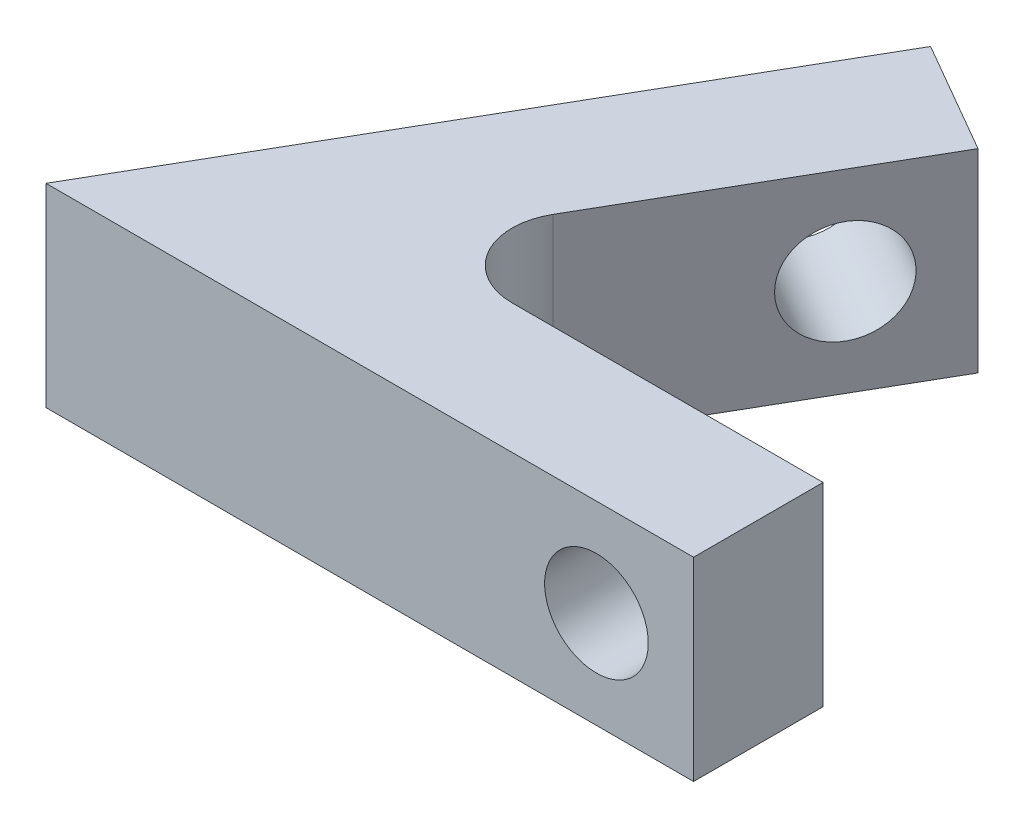
ISO-10303-21;
HEADER;
FILE_DESCRIPTION(('STEP AP214'),'2;1');
FILE_NAME('part.step','',(''),(''),'','','');
FILE_SCHEMA(('AUTOMOTIVE_DESIGN { 1 0 10303 214 1 1 1 1 }'));
ENDSEC;
DATA;
#1=APPLICATION_CONTEXT('core data for automotive mechanical design processes');
#2=APPLICATION_PROTOCOL_DEFINITION('international standard','automotive_design',2000,#1);
#3=PRODUCT_CONTEXT('',#1,'mechanical');
#4=PRODUCT('Part','Part','',(#3));
#5=PRODUCT_RELATED_PRODUCT_CATEGORY('part','',(#4));
#6=PRODUCT_DEFINITION_FORMATION('','',#4);
#7=PRODUCT_DEFINITION_CONTEXT('part definition',#1,'design');
#8=PRODUCT_DEFINITION('design','',#6,#7);
#9=PRODUCT_DEFINITION_SHAPE('','',#8);
#10=(LENGTH_UNIT() NAMED_UNIT(*) SI_UNIT(.MILLI.,.METRE.));
#11=(NAMED_UNIT(*) PLANE_ANGLE_UNIT() SI_UNIT($,.RADIAN.));
#12=(NAMED_UNIT(*) SI_UNIT($,.STERADIAN.) SOLID_ANGLE_UNIT());
#13=UNCERTAINTY_MEASURE_WITH_UNIT(LENGTH_MEASURE(1.E-05),#10,'distance_accuracy_value','');
#14=(GEOMETRIC_REPRESENTATION_CONTEXT(3) GLOBAL_UNCERTAINTY_ASSIGNED_CONTEXT((#13)) GLOBAL_UNIT_ASSIGNED_CONTEXT((#10,
#11,#12)) REPRESENTATION_CONTEXT('',''));
#15=CARTESIAN_POINT('',(0.,0.,0.));
#16=DIRECTION('',(0.,0.,1.));
#17=DIRECTION('',(1.,0.,0.));
#18=AXIS2_PLACEMENT_3D('',#15,#16,#17);
#19=CARTESIAN_POINT('',(6.53589838486228,6.,-11.3205080756887));
#20=DIRECTION('',(-0.866025403784436,0.,-0.500000000000004));
#21=DIRECTION('',(-0.500000000000004,0.,0.866025403784436));
#22=AXIS2_PLACEMENT_3D('',#19,#20,#21);
#23=PLANE('',#22);
#24=CARTESIAN_POINT('',(5.03589838486226,3.,-8.72243186433539));
#25=DIRECTION('',(-0.866025403784436,0.,-0.500000000000004));
#26=DIRECTION('',(-0.500000000000004,0.,0.866025403784436));
#27=AXIS2_PLACEMENT_3D('',#24,#25,#26);
#28=CIRCLE('',#27,1.6);
#29=CARTESIAN_POINT('',(4.23589838486226,3.,-7.33679121828029));
#30=VERTEX_POINT('',#29);
#31=EDGE_CURVE('E154',#30,#30,#28,.T.);
#32=ORIENTED_EDGE('',*,*,#31,.T.);
#33=EDGE_LOOP('',(#32));
#34=FACE_BOUND('',#33,.T.);
#35=DIRECTION('',(0.500000000000004,0.,-0.866025403784436));
#36=VECTOR('',#35,1.);
#37=CARTESIAN_POINT('',(6.53589838486228,6.,-11.3205080756887));
#38=LINE('',#37,#36);
#39=CARTESIAN_POINT('',(1.7320508075689,6.,-3.00000000000001));
#40=VERTEX_POINT('',#39);
#41=CARTESIAN_POINT('',(6.53589838486228,6.,-11.3205080756887));
#42=VERTEX_POINT('',#41);
#43=EDGE_CURVE('E92',#40,#42,#38,.T.);
#44=ORIENTED_EDGE('',*,*,#43,.F.);
#45=DIRECTION('',(0.,-1.,0.));
#46=VECTOR('',#45,1.);
#47=CARTESIAN_POINT('',(1.7320508075689,0.,-3.00000000000001));
#48=LINE('',#47,#46);
#49=CARTESIAN_POINT('',(1.7320508075689,0.,-3.00000000000001));
#50=VERTEX_POINT('',#49);
#51=EDGE_CURVE('E115',#40,#50,#48,.T.);
#52=ORIENTED_EDGE('',*,*,#51,.T.);
#53=DIRECTION('',(0.500000000000004,0.,-0.866025403784436));
#54=VECTOR('',#53,1.);
#55=CARTESIAN_POINT('',(6.53589838486228,0.,-11.3205080756887));
#56=LINE('',#55,#54);
#57=CARTESIAN_POINT('',(6.53589838486228,0.,-11.3205080756887));
#58=VERTEX_POINT('',#57);
#59=EDGE_CURVE('E113',#50,#58,#56,.T.);
#60=ORIENTED_EDGE('',*,*,#59,.T.);
#61=DIRECTION('',(0.,-1.,0.));
#62=VECTOR('',#61,1.);
#63=CARTESIAN_POINT('',(6.53589838486228,6.,-11.3205080756887));
#64=LINE('',#63,#62);
#65=EDGE_CURVE('E107',#42,#58,#64,.T.);
#66=ORIENTED_EDGE('',*,*,#65,.F.);
#67=EDGE_LOOP('',(#44,#52,#60,#66));
#68=FACE_BOUND('',#67,.T.);
#69=ADVANCED_FACE('F34',(#34,#68),#23,.F.);
#70=CARTESIAN_POINT('',(3.07179676972453,6.,-13.3205080756887));
#71=DIRECTION('',(-0.500000000000004,0.,0.866025403784436));
#72=DIRECTION('',(0.866025403784436,0.,0.500000000000004));
#73=AXIS2_PLACEMENT_3D('',#70,#71,#72);
#74=PLANE('',#73);
#75=DIRECTION('',(-0.866025403784436,0.,-0.500000000000004));
#76=VECTOR('',#75,1.);
#77=CARTESIAN_POINT('',(3.07179676972453,0.,-13.3205080756887));
#78=LINE('',#77,#76);
#79=CARTESIAN_POINT('',(3.07179676972453,0.,-13.3205080756887));
#80=VERTEX_POINT('',#79);
#81=EDGE_CURVE('E138',#58,#80,#78,.T.);
#82=ORIENTED_EDGE('',*,*,#81,.T.);
#83=DIRECTION('',(0.,-1.,0.));
#84=VECTOR('',#83,1.);
#85=CARTESIAN_POINT('',(3.07179676972453,6.,-13.3205080756887));
#86=LINE('',#85,#84);
#87=CARTESIAN_POINT('',(3.07179676972453,6.,-13.3205080756887));
#88=VERTEX_POINT('',#87);
#89=EDGE_CURVE('E109',#88,#80,#86,.T.);
#90=ORIENTED_EDGE('',*,*,#89,.F.);
#91=DIRECTION('',(-0.866025403784436,0.,-0.500000000000004));
#92=VECTOR('',#91,1.);
#93=CARTESIAN_POINT('',(3.07179676972453,6.,-13.3205080756887));
#94=LINE('',#93,#92);
#95=EDGE_CURVE('E95',#42,#88,#94,.T.);
#96=ORIENTED_EDGE('',*,*,#95,.F.);
#97=ORIENTED_EDGE('',*,*,#65,.T.);
#98=EDGE_LOOP('',(#82,#90,#96,#97));
#99=FACE_BOUND('',#98,.T.);
#100=ADVANCED_FACE('F106',(#99),#74,.F.);
#101=CARTESIAN_POINT('',(-6.92820323027555,6.,4.));
#102=DIRECTION('',(0.866025403784436,0.,0.500000000000004));
#103=DIRECTION('',(0.500000000000004,0.,-0.866025403784436));
#104=AXIS2_PLACEMENT_3D('',#101,#102,#103);
#105=PLANE('',#104);
#106=CARTESIAN_POINT('',(1.57179676972451,3.,-10.7224318643354));
#107=DIRECTION('',(0.866025403784436,0.,0.500000000000004));
#108=DIRECTION('',(0.500000000000003,0.,-0.866025403784437));
#109=AXIS2_PLACEMENT_3D('',#106,#107,#108);
#110=CIRCLE('',#109,1.6);
#111=CARTESIAN_POINT('',(2.37179676972452,3.,-12.1080725103905));
#112=VERTEX_POINT('',#111);
#113=EDGE_CURVE('E153',#112,#112,#110,.T.);
#114=ORIENTED_EDGE('',*,*,#113,.T.);
#115=EDGE_LOOP('',(#114));
#116=FACE_BOUND('',#115,.T.);
#117=DIRECTION('',(-0.500000000000004,0.,0.866025403784436));
#118=VECTOR('',#117,1.);
#119=CARTESIAN_POINT('',(-6.92820323027555,0.,4.));
#120=LINE('',#119,#118);
#121=CARTESIAN_POINT('',(-6.92820323027555,0.,4.));
#122=VERTEX_POINT('',#121);
#123=EDGE_CURVE('E136',#80,#122,#120,.T.);
#124=ORIENTED_EDGE('',*,*,#123,.T.);
#125=DIRECTION('',(0.,-1.,0.));
#126=VECTOR('',#125,1.);
#127=CARTESIAN_POINT('',(-6.92820323027555,6.,4.));
#128=LINE('',#127,#126);
#129=CARTESIAN_POINT('',(-6.92820323027555,6.,4.));
#130=VERTEX_POINT('',#129);
#131=EDGE_CURVE('E118',#130,#122,#128,.T.);
#132=ORIENTED_EDGE('',*,*,#131,.F.);
#133=DIRECTION('',(-0.500000000000004,0.,0.866025403784436));
#134=VECTOR('',#133,1.);
#135=CARTESIAN_POINT('',(-6.92820323027555,6.,4.));
#136=LINE('',#135,#134);
#137=EDGE_CURVE('E111',#88,#130,#136,.T.);
#138=ORIENTED_EDGE('',*,*,#137,.F.);
#139=ORIENTED_EDGE('',*,*,#89,.T.);
#140=EDGE_LOOP('',(#124,#132,#138,#139));
#141=FACE_BOUND('',#140,.T.);
#142=ADVANCED_FACE('F160',(#116,#141),#105,.F.);
#143=CARTESIAN_POINT('',(13.0717967697244,6.,4.));
#144=DIRECTION('',(0.,0.,-1.));
#145=DIRECTION('',(-1.,0.,0.));
#146=AXIS2_PLACEMENT_3D('',#143,#144,#145);
#147=PLANE('',#146);
#148=CARTESIAN_POINT('',(10.0717967697244,3.,4.));
#149=DIRECTION('',(0.,0.,1.));
#150=DIRECTION('',(1.,0.,0.));
#151=AXIS2_PLACEMENT_3D('',#148,#149,#150);
#152=CIRCLE('',#151,1.6);
#153=CARTESIAN_POINT('',(11.6717967697244,3.,4.));
#154=VERTEX_POINT('',#153);
#155=EDGE_CURVE('E150',#154,#154,#152,.T.);
#156=ORIENTED_EDGE('',*,*,#155,.F.);
#157=EDGE_LOOP('',(#156));
#158=FACE_BOUND('',#157,.T.);
#159=DIRECTION('',(1.,0.,0.));
#160=VECTOR('',#159,1.);
#161=CARTESIAN_POINT('',(13.0717967697244,0.,4.));
#162=LINE('',#161,#160);
#163=CARTESIAN_POINT('',(13.0717967697244,0.,4.));
#164=VERTEX_POINT('',#163);
#165=EDGE_CURVE('E134',#122,#164,#162,.T.);
#166=ORIENTED_EDGE('',*,*,#165,.T.);
#167=DIRECTION('',(0.,-1.,0.));
#168=VECTOR('',#167,1.);
#169=CARTESIAN_POINT('',(13.0717967697244,6.,4.));
#170=LINE('',#169,#168);
#171=CARTESIAN_POINT('',(13.0717967697244,6.,4.));
#172=VERTEX_POINT('',#171);
#173=EDGE_CURVE('E124',#172,#164,#170,.T.);
#174=ORIENTED_EDGE('',*,*,#173,.F.);
#175=DIRECTION('',(1.,0.,0.));
#176=VECTOR('',#175,1.);
#177=CARTESIAN_POINT('',(13.0717967697244,6.,4.));
#178=LINE('',#177,#176);
#179=EDGE_CURVE('E145',#130,#172,#178,.T.);
#180=ORIENTED_EDGE('',*,*,#179,.F.);
#181=ORIENTED_EDGE('',*,*,#131,.T.);
#182=EDGE_LOOP('',(#166,#174,#180,#181));
#183=FACE_BOUND('',#182,.T.);
#184=ADVANCED_FACE('F178',(#158,#183),#147,.F.);
#185=CARTESIAN_POINT('',(13.0717967697245,6.,0.));
#186=DIRECTION('',(-1.,0.,0.));
#187=DIRECTION('',(0.,0.,1.));
#188=AXIS2_PLACEMENT_3D('',#185,#186,#187);
#189=PLANE('',#188);
#190=DIRECTION('',(0.,0.,-1.));
#191=VECTOR('',#190,1.);
#192=CARTESIAN_POINT('',(13.0717967697245,0.,0.));
#193=LINE('',#192,#191);
#194=CARTESIAN_POINT('',(13.0717967697245,0.,0.));
#195=VERTEX_POINT('',#194);
#196=EDGE_CURVE('E132',#164,#195,#193,.T.);
#197=ORIENTED_EDGE('',*,*,#196,.T.);
#198=DIRECTION('',(0.,-1.,0.));
#199=VECTOR('',#198,1.);
#200=CARTESIAN_POINT('',(13.0717967697245,6.,0.));
#201=LINE('',#200,#199);
#202=CARTESIAN_POINT('',(13.0717967697245,6.,0.));
#203=VERTEX_POINT('',#202);
#204=EDGE_CURVE('E127',#203,#195,#201,.T.);
#205=ORIENTED_EDGE('',*,*,#204,.F.);
#206=DIRECTION('',(0.,0.,-1.));
#207=VECTOR('',#206,1.);
#208=CARTESIAN_POINT('',(13.0717967697245,6.,0.));
#209=LINE('',#208,#207);
#210=EDGE_CURVE('E143',#172,#203,#209,.T.);
#211=ORIENTED_EDGE('',*,*,#210,.F.);
#212=ORIENTED_EDGE('',*,*,#173,.T.);
#213=EDGE_LOOP('',(#197,#205,#211,#212));
#214=FACE_BOUND('',#213,.T.);
#215=ADVANCED_FACE('F181',(#214),#189,.F.);
#216=CARTESIAN_POINT('',(0.,6.,0.));
#217=DIRECTION('',(0.,0.,1.));
#218=DIRECTION('',(1.,0.,0.));
#219=AXIS2_PLACEMENT_3D('',#216,#217,#218);
#220=PLANE('',#219);
#221=CARTESIAN_POINT('',(10.0717967697244,3.,0.));
#222=DIRECTION('',(0.,0.,1.));
#223=DIRECTION('',(1.,0.,0.));
#224=AXIS2_PLACEMENT_3D('',#221,#222,#223);
#225=CIRCLE('',#224,1.6);
#226=CARTESIAN_POINT('',(11.6717967697244,3.,0.));
#227=VERTEX_POINT('',#226);
#228=EDGE_CURVE('E141',#227,#227,#225,.F.);
#229=ORIENTED_EDGE('',*,*,#228,.F.);
#230=EDGE_LOOP('',(#229));
#231=FACE_BOUND('',#230,.T.);
#232=DIRECTION('',(-1.,0.,0.));
#233=VECTOR('',#232,1.);
#234=CARTESIAN_POINT('',(0.,0.,0.));
#235=LINE('',#234,#233);
#236=CARTESIAN_POINT('',(3.46410161513777,0.,0.));
#237=VERTEX_POINT('',#236);
#238=EDGE_CURVE('E102',#195,#237,#235,.T.);
#239=ORIENTED_EDGE('',*,*,#238,.T.);
#240=DIRECTION('',(0.,-1.,0.));
#241=VECTOR('',#240,1.);
#242=CARTESIAN_POINT('',(3.46410161513777,6.,0.));
#243=LINE('',#242,#241);
#244=CARTESIAN_POINT('',(3.46410161513777,6.,0.));
#245=VERTEX_POINT('',#244);
#246=EDGE_CURVE('E49',#237,#245,#243,.F.);
#247=ORIENTED_EDGE('',*,*,#246,.T.);
#248=DIRECTION('',(-1.,0.,0.));
#249=VECTOR('',#248,1.);
#250=CARTESIAN_POINT('',(0.,6.,0.));
#251=LINE('',#250,#249);
#252=EDGE_CURVE('E130',#203,#245,#251,.T.);
#253=ORIENTED_EDGE('',*,*,#252,.F.);
#254=ORIENTED_EDGE('',*,*,#204,.T.);
#255=EDGE_LOOP('',(#239,#247,#253,#254));
#256=FACE_BOUND('',#255,.T.);
#257=ADVANCED_FACE('F185',(#231,#256),#220,.F.);
#258=CARTESIAN_POINT('',(0.,6.,0.));
#259=DIRECTION('',(0.,1.,0.));
#260=DIRECTION('',(0.,0.,1.));
#261=AXIS2_PLACEMENT_3D('',#258,#259,#260);
#262=PLANE('',#261);
#263=ORIENTED_EDGE('',*,*,#252,.T.);
#264=CARTESIAN_POINT('',(3.46410161513777,6.,-2.));
#265=DIRECTION('',(0.,1.,0.));
#266=DIRECTION('',(0.,0.,1.));
#267=AXIS2_PLACEMENT_3D('',#264,#265,#266);
#268=CIRCLE('',#267,2.);
#269=EDGE_CURVE('E11',#245,#40,#268,.F.);
#270=ORIENTED_EDGE('',*,*,#269,.T.);
#271=ORIENTED_EDGE('',*,*,#43,.T.);
#272=ORIENTED_EDGE('',*,*,#95,.T.);
#273=ORIENTED_EDGE('',*,*,#137,.T.);
#274=ORIENTED_EDGE('',*,*,#179,.T.);
#275=ORIENTED_EDGE('',*,*,#210,.T.);
#276=EDGE_LOOP('',(#263,#270,#271,#272,#273,#274,#275));
#277=FACE_BOUND('',#276,.T.);
#278=ADVANCED_FACE('F94',(#277),#262,.T.);
#279=CARTESIAN_POINT('',(0.,0.,0.));
#280=DIRECTION('',(0.,1.,0.));
#281=DIRECTION('',(0.,0.,1.));
#282=AXIS2_PLACEMENT_3D('',#279,#280,#281);
#283=PLANE('',#282);
#284=ORIENTED_EDGE('',*,*,#59,.F.);
#285=CARTESIAN_POINT('',(3.46410161513777,0.,-2.));
#286=DIRECTION('',(0.,1.,0.));
#287=DIRECTION('',(0.,0.,1.));
#288=AXIS2_PLACEMENT_3D('',#285,#286,#287);
#289=CIRCLE('',#288,2.);
#290=EDGE_CURVE('E42',#50,#237,#289,.T.);
#291=ORIENTED_EDGE('',*,*,#290,.T.);
#292=ORIENTED_EDGE('',*,*,#238,.F.);
#293=ORIENTED_EDGE('',*,*,#196,.F.);
#294=ORIENTED_EDGE('',*,*,#165,.F.);
#295=ORIENTED_EDGE('',*,*,#123,.F.);
#296=ORIENTED_EDGE('',*,*,#81,.F.);
#297=EDGE_LOOP('',(#284,#291,#292,#293,#294,#295,#296));
#298=FACE_BOUND('',#297,.T.);
#299=ADVANCED_FACE('F190',(#298),#283,.F.);
#300=CARTESIAN_POINT('',(10.0717967697244,3.,-13.3215080756887));
#301=DIRECTION('',(0.,0.,1.));
#302=DIRECTION('',(1.,0.,0.));
#303=AXIS2_PLACEMENT_3D('',#300,#301,#302);
#304=CYLINDRICAL_SURFACE('',#303,1.6);
#305=ORIENTED_EDGE('',*,*,#155,.T.);
#306=EDGE_LOOP('',(#305));
#307=FACE_BOUND('',#306,.T.);
#308=ORIENTED_EDGE('',*,*,#228,.T.);
#309=EDGE_LOOP('',(#308));
#310=FACE_BOUND('',#309,.T.);
#311=ADVANCED_FACE('F166',(#307,#310),#304,.F.);
#312=CARTESIAN_POINT('',(16.5729797824263,3.,-2.06149481378909));
#313=DIRECTION('',(-0.866025403784436,0.,-0.500000000000004));
#314=DIRECTION('',(-0.500000000000004,0.,0.866025403784436));
#315=AXIS2_PLACEMENT_3D('',#312,#313,#314);
#316=CYLINDRICAL_SURFACE('',#315,1.6);
#317=ORIENTED_EDGE('',*,*,#113,.F.);
#318=EDGE_LOOP('',(#317));
#319=FACE_BOUND('',#318,.T.);
#320=ORIENTED_EDGE('',*,*,#31,.F.);
#321=EDGE_LOOP('',(#320));
#322=FACE_BOUND('',#321,.T.);
#323=ADVANCED_FACE('F163',(#319,#322),#316,.F.);
#324=CARTESIAN_POINT('',(3.46410161513777,6.,-2.));
#325=DIRECTION('',(0.,1.,0.));
#326=DIRECTION('',(0.,0.,1.));
#327=AXIS2_PLACEMENT_3D('',#324,#325,#326);
#328=CYLINDRICAL_SURFACE('',#327,2.);
#329=ORIENTED_EDGE('',*,*,#269,.F.);
#330=ORIENTED_EDGE('',*,*,#246,.F.);
#331=ORIENTED_EDGE('',*,*,#290,.F.);
#332=ORIENTED_EDGE('',*,*,#51,.F.);
#333=EDGE_LOOP('',(#329,#330,#331,#332));
#334=FACE_BOUND('',#333,.T.);
#335=ADVANCED_FACE('F36',(#334),#328,.F.);
#336=CLOSED_SHELL('',(#69,#100,#142,#184,#215,#257,#278,#299,#311,#323,#335));
#337=MANIFOLD_SOLID_BREP('B2',#336);
#338=ADVANCED_BREP_SHAPE_REPRESENTATION('',(#18,#337),#14);
#339=SHAPE_DEFINITION_REPRESENTATION(#9,#338);
ENDSEC;
END-ISO-10303-21;
